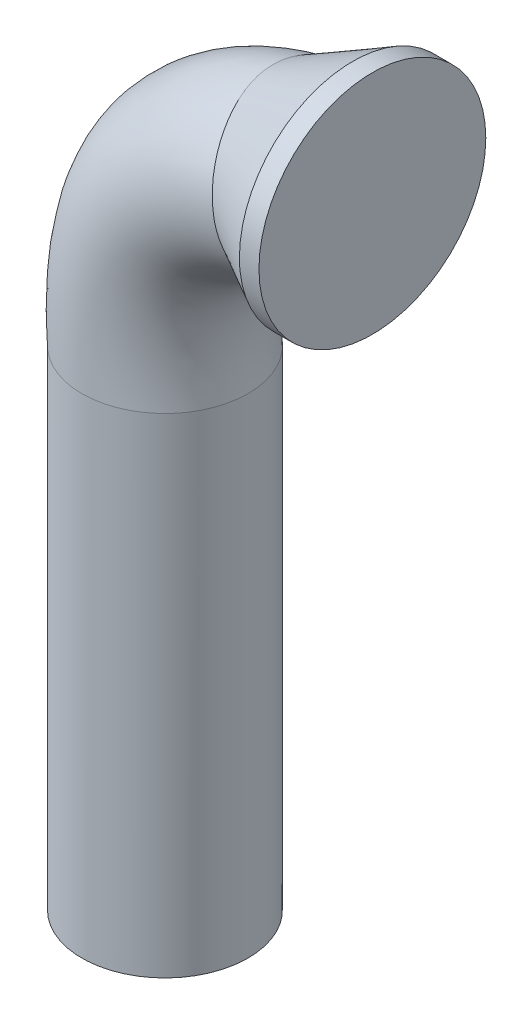
ISO-10303-21;
HEADER;
FILE_DESCRIPTION(('STEP AP214'),'2;1');
FILE_NAME('part.step','',(''),(''),'','','');
FILE_SCHEMA(('AUTOMOTIVE_DESIGN { 1 0 10303 214 1 1 1 1 }'));
ENDSEC;
DATA;
#1=APPLICATION_CONTEXT('core data for automotive mechanical design processes');
#2=APPLICATION_PROTOCOL_DEFINITION('international standard','automotive_design',2000,#1);
#3=PRODUCT_CONTEXT('',#1,'mechanical');
#4=PRODUCT('Part','Part','',(#3));
#5=PRODUCT_RELATED_PRODUCT_CATEGORY('part','',(#4));
#6=PRODUCT_DEFINITION_FORMATION('','',#4);
#7=PRODUCT_DEFINITION_CONTEXT('part definition',#1,'design');
#8=PRODUCT_DEFINITION('design','',#6,#7);
#9=PRODUCT_DEFINITION_SHAPE('','',#8);
#10=(LENGTH_UNIT() NAMED_UNIT(*) SI_UNIT(.MILLI.,.METRE.));
#11=(NAMED_UNIT(*) PLANE_ANGLE_UNIT() SI_UNIT($,.RADIAN.));
#12=(NAMED_UNIT(*) SI_UNIT($,.STERADIAN.) SOLID_ANGLE_UNIT());
#13=UNCERTAINTY_MEASURE_WITH_UNIT(LENGTH_MEASURE(1.E-05),#10,'distance_accuracy_value','');
#14=(GEOMETRIC_REPRESENTATION_CONTEXT(3) GLOBAL_UNCERTAINTY_ASSIGNED_CONTEXT((#13)) GLOBAL_UNIT_ASSIGNED_CONTEXT((#10,
#11,#12)) REPRESENTATION_CONTEXT('',''));
#15=CARTESIAN_POINT('',(0.,0.,0.));
#16=DIRECTION('',(0.,0.,1.));
#17=DIRECTION('',(1.,0.,0.));
#18=AXIS2_PLACEMENT_3D('',#15,#16,#17);
#19=CARTESIAN_POINT('',(106.080716957114,116.,0.));
#20=DIRECTION('',(-1.,0.,0.));
#21=DIRECTION('',(0.,0.,1.));
#22=AXIS2_PLACEMENT_3D('',#19,#20,#21);
#23=CYLINDRICAL_SURFACE('',#22,58.);
#24=CARTESIAN_POINT('',(96.0807169571143,116.,0.));
#25=DIRECTION('',(-1.,0.,0.));
#26=DIRECTION('',(0.,0.,1.));
#27=AXIS2_PLACEMENT_3D('',#24,#25,#26);
#28=CIRCLE('',#27,58.);
#29=CARTESIAN_POINT('',(96.0807169571143,116.,58.));
#30=VERTEX_POINT('',#29);
#31=EDGE_CURVE('E59',#30,#30,#28,.T.);
#32=ORIENTED_EDGE('',*,*,#31,.F.);
#33=EDGE_LOOP('',(#32));
#34=FACE_BOUND('',#33,.T.);
#35=CARTESIAN_POINT('',(106.080716957114,116.,0.));
#36=DIRECTION('',(1.,0.,0.));
#37=DIRECTION('',(0.,0.,-1.));
#38=AXIS2_PLACEMENT_3D('',#35,#36,#37);
#39=CIRCLE('',#38,58.);
#40=CARTESIAN_POINT('',(106.080716957114,116.,-58.));
#41=VERTEX_POINT('',#40);
#42=EDGE_CURVE('E10',#41,#41,#39,.T.);
#43=ORIENTED_EDGE('',*,*,#42,.F.);
#44=EDGE_LOOP('',(#43));
#45=FACE_BOUND('',#44,.T.);
#46=ADVANCED_FACE('F43',(#34,#45),#23,.T.);
#47=CARTESIAN_POINT('',(106.080716957114,116.,0.));
#48=DIRECTION('',(1.,0.,0.));
#49=DIRECTION('',(0.,0.,-1.));
#50=AXIS2_PLACEMENT_3D('',#47,#48,#49);
#51=PLANE('',#50);
#52=ORIENTED_EDGE('',*,*,#42,.T.);
#53=EDGE_LOOP('',(#52));
#54=FACE_BOUND('',#53,.T.);
#55=ADVANCED_FACE('F76',(#54),#51,.T.);
#56=CARTESIAN_POINT('',(96.0807169571143,116.,0.));
#57=DIRECTION('',(1.,0.,0.));
#58=DIRECTION('',(0.,0.,-1.));
#59=AXIS2_PLACEMENT_3D('',#56,#57,#58);
#60=CONICAL_SURFACE('',#59,58.,0.491148528887244);
#61=CARTESIAN_POINT('',(67.5393677090846,111.531652609145,42.5));
#62=CARTESIAN_POINT('',(67.3025175823754,112.743211969967,42.499991051501));
#63=CARTESIAN_POINT('',(67.0606543210093,113.954028873162,42.4459367029111));
#64=CARTESIAN_POINT('',(66.5675009009878,116.364288770668,42.2300021640906));
#65=CARTESIAN_POINT('',(66.3162082779048,117.563728687459,42.0680935975754));
#66=CARTESIAN_POINT('',(65.8046656952767,119.942550789357,41.6374416333971));
#67=CARTESIAN_POINT('',(65.5444077532578,121.121913625558,41.3686006562913));
#68=CARTESIAN_POINT('',(65.0160119382085,123.449832079378,40.7261923939159));
#69=CARTESIAN_POINT('',(64.7478748554322,124.598390764609,40.3526355794527));
#70=CARTESIAN_POINT('',(64.2168505652293,126.805246380056,39.5226913004343));
#71=CARTESIAN_POINT('',(63.9542618041329,127.865284823087,39.0707363117254));
#72=CARTESIAN_POINT('',(63.4239571486114,129.941172376847,38.0772487312917));
#73=CARTESIAN_POINT('',(63.1562413530245,130.957022338201,37.5357178648618));
#74=CARTESIAN_POINT('',(62.6172115543993,132.936799155611,36.3672961041107));
#75=CARTESIAN_POINT('',(62.3458990178211,133.900746408383,35.7404390879982));
#76=CARTESIAN_POINT('',(61.8013530931737,135.770319314819,34.4058101822547));
#77=CARTESIAN_POINT('',(61.5281196992204,136.675944789739,33.698038044656));
#78=CARTESIAN_POINT('',(60.982670716442,138.420373752803,32.2086815321517));
#79=CARTESIAN_POINT('',(60.7104543178502,139.259343202523,31.4272917919003));
#80=CARTESIAN_POINT('',(60.16909890311,140.867521748905,29.7947920471744));
#81=CARTESIAN_POINT('',(59.899959874666,141.636731124379,28.943682321377));
#82=CARTESIAN_POINT('',(59.3681244508777,143.100776009821,27.1775727379643));
#83=CARTESIAN_POINT('',(59.105429346818,143.795596705549,26.2625602140606));
#84=CARTESIAN_POINT('',(58.5907205026356,145.106739701727,24.375093823678));
#85=CARTESIAN_POINT('',(58.3387068893886,145.72306106993,23.4026392752254));
#86=CARTESIAN_POINT('',(57.8477174428236,146.880379810146,21.3958748139716));
#87=CARTESIAN_POINT('',(57.6089146821815,147.420478045956,20.3610039837883));
#88=CARTESIAN_POINT('',(57.1534625751824,148.414850551421,18.2461186249613));
#89=CARTESIAN_POINT('',(56.9368134869755,148.869123821036,17.1661035704721));
#90=CARTESIAN_POINT('',(56.5325471841498,149.690188890278,14.9681072922179));
#91=CARTESIAN_POINT('',(56.3449291705324,150.056983097671,13.8501271143692));
#92=CARTESIAN_POINT('',(56.0059971623069,150.702118868526,11.5834210805105));
#93=CARTESIAN_POINT('',(55.8546830707383,150.980460668227,10.434695306625));
#94=CARTESIAN_POINT('',(55.6379365607185,151.371318812742,8.49557873715725));
#95=CARTESIAN_POINT('',(55.5606172242674,151.508276647609,7.71133572606432));
#96=CARTESIAN_POINT('',(55.4273087105309,151.741967086022,6.13501910423553));
#97=CARTESIAN_POINT('',(55.3713197190534,151.838699339165,5.3429454253487));
#98=CARTESIAN_POINT('',(55.2821081840687,151.991870561076,3.75365507416749));
#99=CARTESIAN_POINT('',(55.2488853246619,152.048310088941,2.95643847339056));
#100=CARTESIAN_POINT('',(55.2060966651597,152.12086823111,1.35977079150929));
#101=CARTESIAN_POINT('',(55.1965237780332,152.136998924513,0.560320451684164));
#102=CARTESIAN_POINT('',(55.201276399422,152.128968279219,-1.03831103549167));
#103=CARTESIAN_POINT('',(55.2156022625314,152.104806342686,-1.83749217867222));
#104=CARTESIAN_POINT('',(55.2677645842172,152.016196840048,-3.43283604130717));
#105=CARTESIAN_POINT('',(55.3056000869848,151.951750911729,-4.2289988821499));
#106=CARTESIAN_POINT('',(55.3902268499239,151.805937728992,-5.59677182423814));
#107=CARTESIAN_POINT('',(55.4316705450505,151.734138767763,-6.16975591802611));
#108=CARTESIAN_POINT('',(55.5257931419602,151.569454061357,-7.31176732556722));
#109=CARTESIAN_POINT('',(55.5784727024864,151.476567079798,-7.88079440530542));
#110=CARTESIAN_POINT('',(55.7523927796613,151.166315592351,-9.58038047835053));
#111=CARTESIAN_POINT('',(55.8895339947237,150.917328391496,-10.7037467961933));
#112=CARTESIAN_POINT('',(56.2000114073688,150.335443081275,-12.9236543230291));
#113=CARTESIAN_POINT('',(56.3733601246546,150.002515939182,-14.0201861063716));
#114=CARTESIAN_POINT('',(56.7495230342558,149.25355372399,-16.1793357918198));
#115=CARTESIAN_POINT('',(56.9523379088365,148.837516726464,-17.2419529079633));
#116=CARTESIAN_POINT('',(57.3861398210109,147.912572950999,-19.3518758749913));
#117=CARTESIAN_POINT('',(57.6176904228386,147.401660095927,-20.3981867919207));
#118=CARTESIAN_POINT('',(58.0985951225173,146.296144814458,-22.4413496635971));
#119=CARTESIAN_POINT('',(58.3479493827563,145.701541624669,-23.4382011670818));
#120=CARTESIAN_POINT('',(58.8590014458844,144.43164416501,-25.3756074719554));
#121=CARTESIAN_POINT('',(59.1206978249184,143.756359189321,-26.3161687390291));
#122=CARTESIAN_POINT('',(59.6519173250196,142.328821785454,-28.1345949885102));
#123=CARTESIAN_POINT('',(59.9214404487138,141.57656933144,-29.0124599498732));
#124=CARTESIAN_POINT('',(60.4672909222767,139.991866078711,-30.7076418608077));
#125=CARTESIAN_POINT('',(60.7436592781692,139.158692349291,-31.5242701260077));
#126=CARTESIAN_POINT('',(61.2974785344182,137.424121920598,-33.0811622012095));
#127=CARTESIAN_POINT('',(61.5749294460842,136.522724506771,-33.8214252111939));
#128=CARTESIAN_POINT('',(62.1284323360403,134.658034720194,-35.2200278358372));
#129=CARTESIAN_POINT('',(62.4044842908157,133.69474131075,-35.8783660777989));
#130=CARTESIAN_POINT('',(62.9532035284323,131.713275424504,-37.1081131937428));
#131=CARTESIAN_POINT('',(63.2258708541864,130.695103644365,-37.679523170902));
#132=CARTESIAN_POINT('',(63.762306034446,128.626638183685,-38.723413611743));
#133=CARTESIAN_POINT('',(64.0261456886632,127.57702980632,-39.1972157001542));
#134=CARTESIAN_POINT('',(64.5478164370414,125.43950144699,-40.0527398783173));
#135=CARTESIAN_POINT('',(64.8056475885309,124.35158183081,-40.4344628469438));
#136=CARTESIAN_POINT('',(65.3143359049389,122.145433366853,-41.1030515183063));
#137=CARTESIAN_POINT('',(65.5651932959183,121.027205503872,-41.3899202991214));
#138=CARTESIAN_POINT('',(66.0591719690836,118.768603880478,-41.8667734081347));
#139=CARTESIAN_POINT('',(66.3022932356457,117.628230075347,-42.0567575406788));
#140=CARTESIAN_POINT('',(66.7797105804221,115.335892259509,-42.3382552308188));
#141=CARTESIAN_POINT('',(67.0140227117921,114.183954716065,-42.4299572139396));
#142=CARTESIAN_POINT('',(67.4737946428543,111.874703341009,-42.5149563761012));
#143=CARTESIAN_POINT('',(67.6992544672946,110.71738952444,-42.5082538302663));
#144=CARTESIAN_POINT('',(68.1408880768595,108.405715155662,-42.396574913704));
#145=CARTESIAN_POINT('',(68.3570616650679,107.251354666568,-42.2915964600927));
#146=CARTESIAN_POINT('',(68.7797362142518,104.953892962372,-41.98419348392));
#147=CARTESIAN_POINT('',(68.9862371198561,103.810791811754,-41.7817684036009));
#148=CARTESIAN_POINT('',(69.3905196783275,101.536708146505,-41.2793677135475));
#149=CARTESIAN_POINT('',(69.5882366748798,100.405850942874,-40.9787727744509));
#150=CARTESIAN_POINT('',(69.973199845818,98.1719290969094,-40.2826157233714));
#151=CARTESIAN_POINT('',(70.1604459826565,97.0688645542455,-39.8870532708708));
#152=CARTESIAN_POINT('',(70.5241628765107,94.8983797435586,-39.0038059487991));
#153=CARTESIAN_POINT('',(70.700633296088,93.8309605922338,-38.5161181963078));
#154=CARTESIAN_POINT('',(71.0424890323117,91.7394007508869,-37.4521080958974));
#155=CARTESIAN_POINT('',(71.2078743057114,90.7152602297143,-36.875785402214));
#156=CARTESIAN_POINT('',(71.5283243911644,88.7108533005729,-35.6344427802298));
#157=CARTESIAN_POINT('',(71.6833129067554,87.7309255605516,-34.9688562271472));
#158=CARTESIAN_POINT('',(71.9814393572147,85.829334832301,-33.556717998314));
#159=CARTESIAN_POINT('',(72.1245772372521,84.9076721136586,-32.8101659479869));
#160=CARTESIAN_POINT('',(72.3986915462451,83.1292159990866,-31.2413658499898));
#161=CARTESIAN_POINT('',(72.5296677631774,82.2724237341402,-30.4191164831293));
#162=CARTESIAN_POINT('',(72.7791418569973,80.6298858265819,-28.7047324985063));
#163=CARTESIAN_POINT('',(72.8976397258991,79.8441402294384,-27.8125978360194));
#164=CARTESIAN_POINT('',(73.122168015331,78.3472075027359,-25.9620678963456));
#165=CARTESIAN_POINT('',(73.2281616431228,77.6362410392135,-25.0034896363756));
#166=CARTESIAN_POINT('',(73.4269793781661,76.2966250323832,-23.029149467396));
#167=CARTESIAN_POINT('',(73.5198034534967,75.6679756885979,-22.0133874197911));
#168=CARTESIAN_POINT('',(73.6919900569308,74.4975872037578,-19.9318872559546));
#169=CARTESIAN_POINT('',(73.7713526615183,73.9558475689084,-18.8661494237147));
#170=CARTESIAN_POINT('',(73.916348439253,72.9632473405365,-16.6922623727951));
#171=CARTESIAN_POINT('',(73.9819816379755,72.5123865777226,-15.5841132331249));
#172=CARTESIAN_POINT('',(74.0992110066726,71.7053525152565,-13.3346522530366));
#173=CARTESIAN_POINT('',(74.1508240586427,71.3490653491706,-12.1933821445827));
#174=CARTESIAN_POINT('',(74.2399219660679,70.7330909551856,-9.8845235409441));
#175=CARTESIAN_POINT('',(74.2774068288662,70.4734036770779,-8.71693505943893));
#176=CARTESIAN_POINT('',(74.338099680063,70.0525548408644,-6.36378297632527));
#177=CARTESIAN_POINT('',(74.361307842772,69.8913920798294,-5.17821959436139));
#178=CARTESIAN_POINT('',(74.3933535051444,69.6687842644023,-2.79757556615988));
#179=CARTESIAN_POINT('',(74.4021910291584,69.6073390410415,-1.60249493605241));
#180=CARTESIAN_POINT('',(74.4054550401579,69.5846499110555,0.785738496479299));
#181=CARTESIAN_POINT('',(74.3999163862475,69.6231636257321,1.97888895566609));
#182=CARTESIAN_POINT('',(74.374524602861,69.7995944669503,4.35766261858639));
#183=CARTESIAN_POINT('',(74.3546714982551,69.937511420786,5.54328583539434));
#184=CARTESIAN_POINT('',(74.3007316802222,70.3117287190043,7.89857141713403));
#185=CARTESIAN_POINT('',(74.2666449901788,70.548028901758,9.06823380828374));
#186=CARTESIAN_POINT('',(74.1843732444046,71.1172700209405,11.3832942016099));
#187=CARTESIAN_POINT('',(74.1361881802206,71.4502110153131,12.5286921892374));
#188=CARTESIAN_POINT('',(74.0259137888457,72.2102171528273,14.7868996266736));
#189=CARTESIAN_POINT('',(73.9638269973333,72.6372651306077,15.8997149777591));
#190=CARTESIAN_POINT('',(73.8259695470923,73.5823952657545,18.0851099366633));
#191=CARTESIAN_POINT('',(73.7501988918938,74.1004773996371,19.1576895548615));
#192=CARTESIAN_POINT('',(73.5852338357339,75.223891200075,21.2550302105447));
#193=CARTESIAN_POINT('',(73.4960396984126,75.829221153054,22.2797921866611));
#194=CARTESIAN_POINT('',(73.3045097353718,77.1227490966303,24.2743096357155));
#195=CARTESIAN_POINT('',(73.2021738941182,77.8109471851806,25.2440650436319));
#196=CARTESIAN_POINT('',(72.9844205692333,79.2668446637623,27.1238219592262));
#197=CARTESIAN_POINT('',(72.8689747822056,80.0347157413443,28.0336872179559));
#198=CARTESIAN_POINT('',(72.6254952870245,81.6431541320285,29.784904218668));
#199=CARTESIAN_POINT('',(72.4974615184035,82.4837217943337,30.6262556315019));
#200=CARTESIAN_POINT('',(72.2290901913052,84.2316938965823,32.2346825656261));
#201=CARTESIAN_POINT('',(72.0887497884718,85.1391137798767,33.001740829333));
#202=CARTESIAN_POINT('',(71.7961072209505,87.0140710010947,34.4559132692373));
#203=CARTESIAN_POINT('',(71.6438052059547,87.9816075866639,35.1430284456055));
#204=CARTESIAN_POINT('',(71.3272348773948,89.971823456216,36.4337195071966));
#205=CARTESIAN_POINT('',(71.1629433045091,90.9946088662022,37.0371260520834));
#206=CARTESIAN_POINT('',(70.822963587145,93.0862145073015,38.154464030063));
#207=CARTESIAN_POINT('',(70.6472747901335,94.1550373730493,38.6683903338657));
#208=CARTESIAN_POINT('',(70.2850047435462,96.3298053794718,39.6025296736531));
#209=CARTESIAN_POINT('',(70.0984343067396,97.4357132204926,40.0228338028771));
#210=CARTESIAN_POINT('',(69.7145818302635,99.6774750747258,40.7672226899577));
#211=CARTESIAN_POINT('',(69.5173021939019,100.813322339881,41.0913289313599));
#212=CARTESIAN_POINT('',(69.1763335515084,102.744384282692,41.5541751302205));
#213=CARTESIAN_POINT('',(69.03539250937,103.53390764176,41.71913150777));
#214=CARTESIAN_POINT('',(68.748730362672,105.120565136748,42.0023900749152));
#215=CARTESIAN_POINT('',(68.6030087056768,105.917700144651,42.1206868519331));
#216=CARTESIAN_POINT('',(68.3069096720414,107.516788735254,42.3101558055535));
#217=CARTESIAN_POINT('',(68.1565317739671,108.318742849463,42.3813226841409));
#218=CARTESIAN_POINT('',(67.851293004285,109.924457819338,42.4762451120369));
#219=CARTESIAN_POINT('',(67.6964326331868,110.728218464115,42.5000059341126));
#220=CARTESIAN_POINT('',(67.5393677090846,111.531652609145,42.5));
#221=B_SPLINE_CURVE_WITH_KNOTS('',3,(#61,#62,#63,#64,#65,#66,#67,#68,#69,#70,#71,#72,#73,#74,
#75,#76,#77,#78,#79,#80,#81,#82,#83,#84,#85,#86,#87,#88,#89,#90,#91,#92,#93,#94,#95,#96,#97,#98,
#99,#100,#101,#102,#103,#104,#105,#106,#107,#108,#109,#110,#111,#112,#113,#114,#115,#116,#117,
#118,#119,#120,#121,#122,#123,#124,#125,#126,#127,#128,#129,#130,#131,#132,#133,#134,#135,#136,
#137,#138,#139,#140,#141,#142,#143,#144,#145,#146,#147,#148,#149,#150,#151,#152,#153,#154,#155,
#156,#157,#158,#159,#160,#161,#162,#163,#164,#165,#166,#167,#168,#169,#170,#171,#172,#173,#174,
#175,#176,#177,#178,#179,#180,#181,#182,#183,#184,#185,#186,#187,#188,#189,#190,#191,#192,#193,
#194,#195,#196,#197,#198,#199,#200,#201,#202,#203,#204,#205,#206,#207,#208,#209,#210,#211,#212,
#213,#214,#215,#216,#217,#218,#219,#220),.UNSPECIFIED.,.T.,.F.,(4,2,2,2,2,2,2,2,2,2,2,2,2,2,2,2,
2,2,2,2,2,2,2,2,2,2,2,2,2,2,2,2,2,2,2,2,2,2,2,2,2,2,2,2,2,2,2,2,2,2,2,2,2,2,2,2,2,2,2,2,2,2,2,2,
2,2,2,2,2,2,2,2,2,2,2,2,2,2,2,4),(0.,3.70268805644851,7.40635066958603,11.1134007826127,
14.8200803502855,18.3615963395032,21.903044124555,25.4430898794951,28.9831464833401,
32.5140931465992,36.0450256970331,39.5766601172509,43.1083364748017,46.678702181816,
50.2491094884906,53.819418512271,57.3897180003688,59.7880823353349,62.1864675618769,
64.5848195080709,66.9824526687418,69.3801214042454,71.7776926664007,73.5140471013622,
75.2505033643762,78.7225043311746,82.1957078276343,85.6689917561698,89.2264378791433,
92.7839164539072,96.3409856174143,99.8980559748653,103.490488213714,107.082958083762,
110.675488139625,114.267972600104,117.808048036881,121.348089683092,124.888016441408,
128.427950348416,131.961085323126,135.494210419722,139.027410399938,142.560630603466,
146.116586110392,149.672554367819,153.228633922268,156.784727349314,160.364568638429,
163.944426489927,167.524346740051,171.104269281224,174.694475758834,178.284690938333,
181.874885718598,185.4650738109,189.050919512905,192.636763351125,196.222563407319,
199.808357387465,203.385464724264,206.962565846107,210.539661091332,214.116758481318,
217.693203938605,221.269648473283,224.846022774964,228.422401304083,232.006653270645,
235.59092245536,239.176022244451,242.761077175411,246.353281993791,249.945692660954,
253.534592537962,257.122690314111,259.5778053851,262.03320516911,264.488880925231,
266.944283532105),.UNSPECIFIED.);
#222=CARTESIAN_POINT('',(67.5393677090846,111.531652609145,42.5));
#223=VERTEX_POINT('',#222);
#224=EDGE_CURVE('E54',#223,#223,#221,.T.);
#225=ORIENTED_EDGE('',*,*,#224,.F.);
#226=EDGE_LOOP('',(#225));
#227=FACE_BOUND('',#226,.T.);
#228=ORIENTED_EDGE('',*,*,#31,.T.);
#229=EDGE_LOOP('',(#228));
#230=FACE_BOUND('',#229,.T.);
#231=ADVANCED_FACE('F71',(#227,#230),#60,.T.);
#232=CARTESIAN_POINT('',(0.,0.,42.5));
#233=CARTESIAN_POINT('',(-0.762541713170615,9.24484220359121,42.5));
#234=CARTESIAN_POINT('',(-0.908932378863223,17.9382457984023,42.5));
#235=CARTESIAN_POINT('',(0.0305883847174958,34.2221757704516,42.5));
#236=CARTESIAN_POINT('',(1.11649981398386,41.8127021477459,42.5));
#237=CARTESIAN_POINT('',(4.52062476748061,55.890877684575,42.5));
#238=CARTESIAN_POINT('',(6.83883829170756,62.3785268443397,42.5));
#239=CARTESIAN_POINT('',(12.707567435123,74.2509479460614,42.5));
#240=CARTESIAN_POINT('',(16.2580830543119,79.6357198882444,42.5));
#241=CARTESIAN_POINT('',(24.5914163876408,89.3023865548501,42.5));
#242=CARTESIAN_POINT('',(29.3742341017839,93.5842812794414,42.5));
#243=CARTESIAN_POINT('',(40.1721716250467,101.04519351096,42.5));
#244=CARTESIAN_POINT('',(46.1872914341434,104.224211017933,42.5));
#245=CARTESIAN_POINT('',(59.4498331473211,109.479368814387,42.5));
#246=CARTESIAN_POINT('',(66.6972550513452,111.555509103718,42.5));
#247=CARTESIAN_POINT('',(82.424400954509,114.604912465135,42.5));
#248=CARTESIAN_POINT('',(90.9041249534801,115.578175536712,42.5));
#249=CARTESIAN_POINT('',(100.,116.,42.5));
#250=CARTESIAN_POINT('',(85.,0.,42.5));
#251=CARTESIAN_POINT('',(84.2374582869581,5.77055223833934,42.5));
#252=CARTESIAN_POINT('',(83.8871686366573,10.5339052853133,42.5));
#253=CARTESIAN_POINT('',(83.5728920500742,17.9161491523211,42.5));
#254=CARTESIAN_POINT('',(83.6043492061505,20.5230719317901,42.5));
#255=CARTESIAN_POINT('',(83.427144946316,23.7777226662494,42.5));
#256=CARTESIAN_POINT('',(83.1968224864673,24.4187890152648,42.5));
#257=CARTESIAN_POINT('',(82.0387070181709,24.6054392835327,42.5));
#258=CARTESIAN_POINT('',(81.0920905777248,24.1790027730165,42.5));
#259=CARTESIAN_POINT('',(78.9567233815007,23.5505090135429,42.5));
#260=CARTESIAN_POINT('',(77.797451418843,23.381837090061,42.5));
#261=CARTESIAN_POINT('',(76.5627524305779,23.9159722376146,42.5));
#262=CARTESIAN_POINT('',(76.5195192924931,24.6033399833411,42.5));
#263=CARTESIAN_POINT('',(78.5376382349699,26.4421310944009,42.5));
#264=CARTESIAN_POINT('',(80.5943733122196,27.5699072558448,42.5));
#265=CARTESIAN_POINT('',(87.0579900562881,29.6034944427252,42.5));
#266=CARTESIAN_POINT('',(91.4520067507086,30.5034978203809,42.5));
#267=CARTESIAN_POINT('',(96.9445273037314,31.0549348896456,42.5));
#268=CARTESIAN_POINT('',(85.,0.,-42.5));
#269=CARTESIAN_POINT('',(84.2374582869581,5.77055223833934,-42.5));
#270=CARTESIAN_POINT('',(83.8871686366573,10.5339052853133,-42.5));
#271=CARTESIAN_POINT('',(83.5728920500742,17.9161491523211,-42.5));
#272=CARTESIAN_POINT('',(83.6043492061505,20.5230719317901,-42.5));
#273=CARTESIAN_POINT('',(83.427144946316,23.7777226662494,-42.5));
#274=CARTESIAN_POINT('',(83.1968224864673,24.4187890152648,-42.5));
#275=CARTESIAN_POINT('',(82.0387070181709,24.6054392835327,-42.5));
#276=CARTESIAN_POINT('',(81.0920905777248,24.1790027730165,-42.5));
#277=CARTESIAN_POINT('',(78.9567233815007,23.5505090135429,-42.5));
#278=CARTESIAN_POINT('',(77.797451418843,23.381837090061,-42.5));
#279=CARTESIAN_POINT('',(76.5627524305779,23.9159722376146,-42.5));
#280=CARTESIAN_POINT('',(76.5195192924931,24.6033399833411,-42.5));
#281=CARTESIAN_POINT('',(78.5376382349699,26.4421310944009,-42.5));
#282=CARTESIAN_POINT('',(80.5943733122196,27.5699072558448,-42.5));
#283=CARTESIAN_POINT('',(87.0579900562881,29.6034944427252,-42.5));
#284=CARTESIAN_POINT('',(91.4520067507086,30.5034978203809,-42.5));
#285=CARTESIAN_POINT('',(96.9445273037314,31.0549348896456,-42.5));
#286=CARTESIAN_POINT('',(0.,0.,-42.5));
#287=CARTESIAN_POINT('',(-0.76254171317061,9.24484220359121,-42.5));
#288=CARTESIAN_POINT('',(-0.908932378863218,17.9382457984023,-42.5));
#289=CARTESIAN_POINT('',(0.0305883847175009,34.2221757704516,-42.5));
#290=CARTESIAN_POINT('',(1.11649981398387,41.8127021477459,-42.5));
#291=CARTESIAN_POINT('',(4.52062476748061,55.890877684575,-42.5));
#292=CARTESIAN_POINT('',(6.83883829170757,62.3785268443397,-42.5));
#293=CARTESIAN_POINT('',(12.707567435123,74.2509479460614,-42.5));
#294=CARTESIAN_POINT('',(16.2580830543119,79.6357198882444,-42.5));
#295=CARTESIAN_POINT('',(24.5914163876408,89.3023865548501,-42.5));
#296=CARTESIAN_POINT('',(29.3742341017839,93.5842812794414,-42.5));
#297=CARTESIAN_POINT('',(40.1721716250467,101.04519351096,-42.5));
#298=CARTESIAN_POINT('',(46.1872914341434,104.224211017933,-42.5));
#299=CARTESIAN_POINT('',(59.4498331473211,109.479368814387,-42.5));
#300=CARTESIAN_POINT('',(66.6972550513452,111.555509103718,-42.5));
#301=CARTESIAN_POINT('',(82.424400954509,114.604912465135,-42.5));
#302=CARTESIAN_POINT('',(90.9041249534801,115.578175536712,-42.5));
#303=CARTESIAN_POINT('',(100.,116.,-42.5));
#304=CARTESIAN_POINT('',(-85.,0.,-42.5));
#305=CARTESIAN_POINT('',(-85.7625417132993,12.7191321688431,-42.5));
#306=CARTESIAN_POINT('',(-85.7050333943837,25.3425863114912,-42.5));
#307=CARTESIAN_POINT('',(-83.5117152806393,50.5282023885821,-42.5));
#308=CARTESIAN_POINT('',(-81.3713495781828,63.1023323637017,-42.5));
#309=CARTESIAN_POINT('',(-74.3858954113548,88.0040327029007,-42.5));
#310=CARTESIAN_POINT('',(-69.5191459030522,100.338264673415,-42.5));
#311=CARTESIAN_POINT('',(-56.6235721479248,123.89645660859,-42.5));
#312=CARTESIAN_POINT('',(-48.5759244691011,135.092437003472,-42.5));
#313=CARTESIAN_POINT('',(-29.7738906062192,155.054264096157,-42.5));
#314=CARTESIAN_POINT('',(-19.0489832152751,163.786725468822,-42.5));
#315=CARTESIAN_POINT('',(3.78159081951536,178.174414784305,-42.5));
#316=CARTESIAN_POINT('',(15.8550635757938,183.845082052526,-42.5));
#317=CARTESIAN_POINT('',(40.3620280596723,192.516606534374,-42.5));
#318=CARTESIAN_POINT('',(52.8001367904709,195.541110951592,-42.5));
#319=CARTESIAN_POINT('',(77.7908118527299,199.606330487546,-42.5));
#320=CARTESIAN_POINT('',(90.3562431562516,200.652853253044,-42.5));
#321=CARTESIAN_POINT('',(103.055472696269,200.945065110354,-42.5));
#322=CARTESIAN_POINT('',(-85.,0.,42.5));
#323=CARTESIAN_POINT('',(-85.7625417132993,12.7191321688431,42.5));
#324=CARTESIAN_POINT('',(-85.7050333943837,25.3425863114912,42.5));
#325=CARTESIAN_POINT('',(-83.5117152806393,50.5282023885821,42.5));
#326=CARTESIAN_POINT('',(-81.3713495781828,63.1023323637017,42.5));
#327=CARTESIAN_POINT('',(-74.3858954113548,88.0040327029007,42.5));
#328=CARTESIAN_POINT('',(-69.5191459030522,100.338264673415,42.5));
#329=CARTESIAN_POINT('',(-56.6235721479248,123.89645660859,42.5));
#330=CARTESIAN_POINT('',(-48.5759244691011,135.092437003472,42.5));
#331=CARTESIAN_POINT('',(-29.7738906062192,155.054264096157,42.5));
#332=CARTESIAN_POINT('',(-19.0489832152751,163.786725468822,42.5));
#333=CARTESIAN_POINT('',(3.78159081951536,178.174414784305,42.5));
#334=CARTESIAN_POINT('',(15.8550635757938,183.845082052526,42.5));
#335=CARTESIAN_POINT('',(40.3620280596723,192.516606534374,42.5));
#336=CARTESIAN_POINT('',(52.8001367904709,195.541110951592,42.5));
#337=CARTESIAN_POINT('',(77.7908118527299,199.606330487546,42.5));
#338=CARTESIAN_POINT('',(90.3562431562516,200.652853253044,42.5));
#339=CARTESIAN_POINT('',(103.055472696269,200.945065110354,42.5));
#340=CARTESIAN_POINT('',(0.,0.,42.5));
#341=CARTESIAN_POINT('',(-0.762541713170615,9.24484220359121,42.5));
#342=CARTESIAN_POINT('',(-0.908932378863223,17.9382457984023,42.5));
#343=CARTESIAN_POINT('',(0.0305883847174958,34.2221757704516,42.5));
#344=CARTESIAN_POINT('',(1.11649981398386,41.8127021477459,42.5));
#345=CARTESIAN_POINT('',(4.52062476748061,55.890877684575,42.5));
#346=CARTESIAN_POINT('',(6.83883829170756,62.3785268443397,42.5));
#347=CARTESIAN_POINT('',(12.707567435123,74.2509479460614,42.5));
#348=CARTESIAN_POINT('',(16.2580830543119,79.6357198882444,42.5));
#349=CARTESIAN_POINT('',(24.5914163876408,89.3023865548501,42.5));
#350=CARTESIAN_POINT('',(29.3742341017839,93.5842812794414,42.5));
#351=CARTESIAN_POINT('',(40.1721716250467,101.04519351096,42.5));
#352=CARTESIAN_POINT('',(46.1872914341434,104.224211017933,42.5));
#353=CARTESIAN_POINT('',(59.4498331473211,109.479368814387,42.5));
#354=CARTESIAN_POINT('',(66.6972550513452,111.555509103718,42.5));
#355=CARTESIAN_POINT('',(82.424400954509,114.604912465135,42.5));
#356=CARTESIAN_POINT('',(90.9041249534801,115.578175536712,42.5));
#357=CARTESIAN_POINT('',(100.,116.,42.5));
#358=(BOUNDED_SURFACE() B_SPLINE_SURFACE(3,3,((#232,#233,#234,#235,#236,#237,#238,#239,#240,
#241,#242,#243,#244,#245,#246,#247,#248,#249),(#250,#251,#252,#253,#254,#255,#256,#257,#258,
#259,#260,#261,#262,#263,#264,#265,#266,#267),(#268,#269,#270,#271,#272,#273,#274,#275,#276,
#277,#278,#279,#280,#281,#282,#283,#284,#285),(#286,#287,#288,#289,#290,#291,#292,#293,#294,
#295,#296,#297,#298,#299,#300,#301,#302,#303),(#304,#305,#306,#307,#308,#309,#310,#311,#312,
#313,#314,#315,#316,#317,#318,#319,#320,#321),(#322,#323,#324,#325,#326,#327,#328,#329,#330,
#331,#332,#333,#334,#335,#336,#337,#338,#339),(#340,#341,#342,#343,#344,#345,#346,#347,#348,
#349,#350,#351,#352,#353,#354,#355,#356,#357)),.UNSPECIFIED.,.T.,.F.,
.F.) B_SPLINE_SURFACE_WITH_KNOTS((4,3,4),(4,2,2,2,2,2,2,2,4),(0.,0.5,1.),(0.,0.125,0.25,0.375,
0.5,0.625,0.75,0.875,1.),
.UNSPECIFIED.) GEOMETRIC_REPRESENTATION_ITEM() RATIONAL_B_SPLINE_SURFACE(((1.,1.,1.,1.,1.,1.,1.,
1.,1.,1.,1.,1.,1.,1.,1.,1.,1.,1.),(0.333333333333333,0.333333333333333,0.333333333333333,
0.333333333333333,0.333333333333333,0.333333333333333,0.333333333333333,0.333333333333333,
0.333333333333333,0.333333333333333,0.333333333333333,0.333333333333333,0.333333333333333,
0.333333333333333,0.333333333333333,0.333333333333333,0.333333333333333,0.333333333333333),
(0.333333333333333,0.333333333333333,0.333333333333333,0.333333333333333,0.333333333333333,
0.333333333333333,0.333333333333333,0.333333333333333,0.333333333333333,0.333333333333333,
0.333333333333333,0.333333333333333,0.333333333333333,0.333333333333333,0.333333333333333,
0.333333333333333,0.333333333333333,0.333333333333333),(1.,1.,1.,1.,1.,1.,1.,1.,1.,1.,1.,1.,1.,
1.,1.,1.,1.,1.),(0.333333333333333,0.333333333333333,0.333333333333333,0.333333333333333,
0.333333333333333,0.333333333333333,0.333333333333333,0.333333333333333,0.333333333333333,
0.333333333333333,0.333333333333333,0.333333333333333,0.333333333333333,0.333333333333333,
0.333333333333333,0.333333333333333,0.333333333333333,0.333333333333333),(0.333333333333333,
0.333333333333333,0.333333333333333,0.333333333333333,0.333333333333333,0.333333333333333,
0.333333333333333,0.333333333333333,0.333333333333333,0.333333333333333,0.333333333333333,
0.333333333333333,0.333333333333333,0.333333333333333,0.333333333333333,0.333333333333333,
0.333333333333333,0.333333333333333),(1.,1.,1.,1.,1.,1.,1.,1.,1.,1.,1.,1.,1.,1.,1.,1.,1.,1.))) REPRESENTATION_ITEM('') SURFACE());
#359=CARTESIAN_POINT('',(0.,0.,0.));
#360=DIRECTION('',(0.,-1.,0.));
#361=DIRECTION('',(0.,0.,-1.));
#362=AXIS2_PLACEMENT_3D('',#359,#360,#361);
#363=CIRCLE('',#362,42.5);
#364=CARTESIAN_POINT('',(0.,0.,-42.5));
#365=VERTEX_POINT('',#364);
#366=EDGE_CURVE('E126',#365,#365,#363,.T.);
#367=ORIENTED_EDGE('',*,*,#366,.F.);
#368=EDGE_LOOP('',(#367));
#369=FACE_BOUND('',#368,.T.);
#370=ORIENTED_EDGE('',*,*,#224,.T.);
#371=EDGE_LOOP('',(#370));
#372=FACE_BOUND('',#371,.T.);
#373=ADVANCED_FACE('F45',(#369,#372),#358,.T.);
#374=CARTESIAN_POINT('',(0.,-250.,0.));
#375=DIRECTION('',(0.,1.,0.));
#376=DIRECTION('',(0.,0.,1.));
#377=AXIS2_PLACEMENT_3D('',#374,#375,#376);
#378=CYLINDRICAL_SURFACE('',#377,42.5);
#379=CARTESIAN_POINT('',(0.,-250.,0.));
#380=DIRECTION('',(0.,-1.,0.));
#381=DIRECTION('',(0.,0.,-1.));
#382=AXIS2_PLACEMENT_3D('',#379,#380,#381);
#383=CIRCLE('',#382,42.5);
#384=CARTESIAN_POINT('',(0.,-250.,-42.5));
#385=VERTEX_POINT('',#384);
#386=EDGE_CURVE('E64',#385,#385,#383,.T.);
#387=ORIENTED_EDGE('',*,*,#386,.F.);
#388=EDGE_LOOP('',(#387));
#389=FACE_BOUND('',#388,.T.);
#390=ORIENTED_EDGE('',*,*,#366,.T.);
#391=EDGE_LOOP('',(#390));
#392=FACE_BOUND('',#391,.T.);
#393=ADVANCED_FACE('F78',(#389,#392),#378,.T.);
#394=CARTESIAN_POINT('',(0.,-250.,0.));
#395=DIRECTION('',(0.,-1.,0.));
#396=DIRECTION('',(0.,0.,-1.));
#397=AXIS2_PLACEMENT_3D('',#394,#395,#396);
#398=PLANE('',#397);
#399=ORIENTED_EDGE('',*,*,#386,.T.);
#400=EDGE_LOOP('',(#399));
#401=FACE_BOUND('',#400,.T.);
#402=ADVANCED_FACE('F109',(#401),#398,.T.);
#403=CLOSED_SHELL('',(#46,#55,#231,#373,#393,#402));
#404=MANIFOLD_SOLID_BREP('B2',#403);
#405=ADVANCED_BREP_SHAPE_REPRESENTATION('',(#18,#404),#14);
#406=SHAPE_DEFINITION_REPRESENTATION(#9,#405);
ENDSEC;
END-ISO-10303-21;
